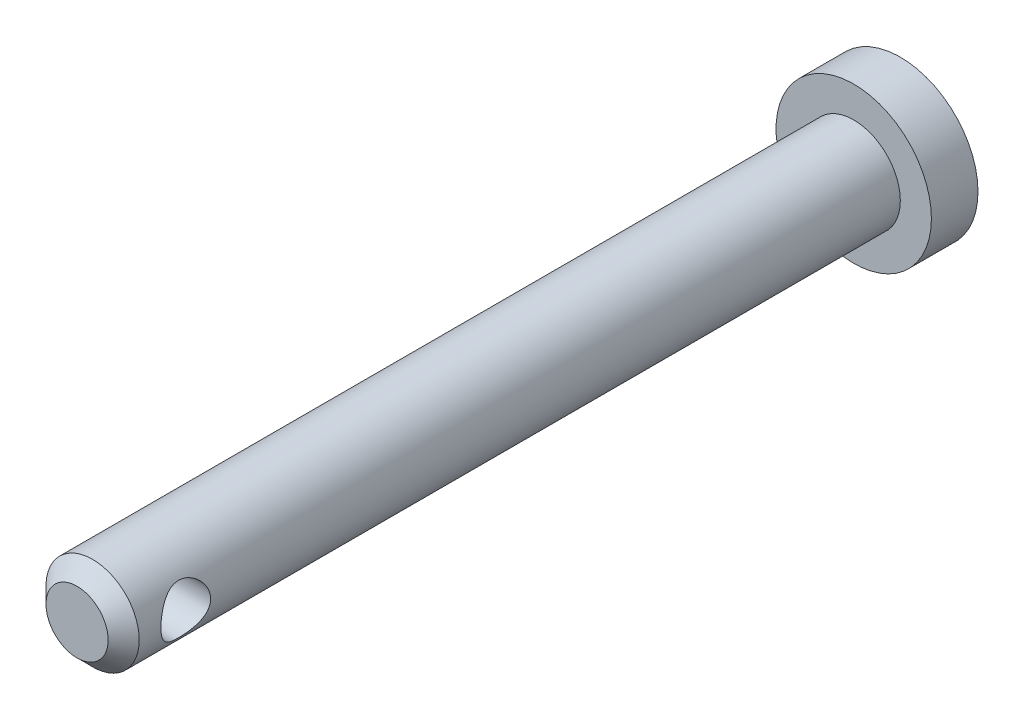
ISO-10303-21;
HEADER;
FILE_DESCRIPTION(('STEP AP214'),'2;1');
FILE_NAME('part.step','',(''),(''),'','','');
FILE_SCHEMA(('AUTOMOTIVE_DESIGN { 1 0 10303 214 1 1 1 1 }'));
ENDSEC;
DATA;
#1=APPLICATION_CONTEXT('core data for automotive mechanical design processes');
#2=APPLICATION_PROTOCOL_DEFINITION('international standard','automotive_design',2000,#1);
#3=PRODUCT_CONTEXT('',#1,'mechanical');
#4=PRODUCT('Part','Part','',(#3));
#5=PRODUCT_RELATED_PRODUCT_CATEGORY('part','',(#4));
#6=PRODUCT_DEFINITION_FORMATION('','',#4);
#7=PRODUCT_DEFINITION_CONTEXT('part definition',#1,'design');
#8=PRODUCT_DEFINITION('design','',#6,#7);
#9=PRODUCT_DEFINITION_SHAPE('','',#8);
#10=(LENGTH_UNIT() NAMED_UNIT(*) SI_UNIT(.MILLI.,.METRE.));
#11=(NAMED_UNIT(*) PLANE_ANGLE_UNIT() SI_UNIT($,.RADIAN.));
#12=(NAMED_UNIT(*) SI_UNIT($,.STERADIAN.) SOLID_ANGLE_UNIT());
#13=UNCERTAINTY_MEASURE_WITH_UNIT(LENGTH_MEASURE(1.E-05),#10,'distance_accuracy_value','');
#14=(GEOMETRIC_REPRESENTATION_CONTEXT(3) GLOBAL_UNCERTAINTY_ASSIGNED_CONTEXT((#13)) GLOBAL_UNIT_ASSIGNED_CONTEXT((#10,
#11,#12)) REPRESENTATION_CONTEXT('',''));
#15=CARTESIAN_POINT('',(0.,0.,0.));
#16=DIRECTION('',(0.,0.,1.));
#17=DIRECTION('',(1.,0.,0.));
#18=AXIS2_PLACEMENT_3D('',#15,#16,#17);
#19=CARTESIAN_POINT('',(0.,0.,1.5));
#20=DIRECTION('',(0.,0.,-1.));
#21=DIRECTION('',(-1.,0.,0.));
#22=AXIS2_PLACEMENT_3D('',#19,#20,#21);
#23=CYLINDRICAL_SURFACE('',#22,2.5);
#24=CARTESIAN_POINT('',(0.,0.,1.5));
#25=DIRECTION('',(0.,0.,1.));
#26=DIRECTION('',(1.,0.,0.));
#27=AXIS2_PLACEMENT_3D('',#24,#25,#26);
#28=CIRCLE('',#27,2.5);
#29=CARTESIAN_POINT('',(2.5,0.,1.5));
#30=VERTEX_POINT('',#29);
#31=EDGE_CURVE('E55',#30,#30,#28,.T.);
#32=ORIENTED_EDGE('',*,*,#31,.F.);
#33=EDGE_LOOP('',(#32));
#34=FACE_BOUND('',#33,.T.);
#35=CARTESIAN_POINT('',(0.,0.,0.));
#36=DIRECTION('',(0.,0.,1.));
#37=DIRECTION('',(1.,0.,0.));
#38=AXIS2_PLACEMENT_3D('',#35,#36,#37);
#39=CIRCLE('',#38,2.5);
#40=CARTESIAN_POINT('',(2.5,0.,0.));
#41=VERTEX_POINT('',#40);
#42=EDGE_CURVE('E100',#41,#41,#39,.T.);
#43=ORIENTED_EDGE('',*,*,#42,.T.);
#44=EDGE_LOOP('',(#43));
#45=FACE_BOUND('',#44,.T.);
#46=ADVANCED_FACE('F37',(#34,#45),#23,.T.);
#47=CARTESIAN_POINT('',(0.,0.,1.5));
#48=DIRECTION('',(0.,0.,1.));
#49=DIRECTION('',(1.,0.,0.));
#50=AXIS2_PLACEMENT_3D('',#47,#48,#49);
#51=PLANE('',#50);
#52=CARTESIAN_POINT('',(0.,0.,1.5));
#53=DIRECTION('',(0.,0.,1.));
#54=DIRECTION('',(1.,0.,0.));
#55=AXIS2_PLACEMENT_3D('',#52,#53,#54);
#56=CIRCLE('',#55,1.5);
#57=CARTESIAN_POINT('',(1.5,0.,1.5));
#58=VERTEX_POINT('',#57);
#59=EDGE_CURVE('E65',#58,#58,#56,.T.);
#60=ORIENTED_EDGE('',*,*,#59,.F.);
#61=EDGE_LOOP('',(#60));
#62=FACE_BOUND('',#61,.T.);
#63=ORIENTED_EDGE('',*,*,#31,.T.);
#64=EDGE_LOOP('',(#63));
#65=FACE_BOUND('',#64,.T.);
#66=ADVANCED_FACE('F85',(#62,#65),#51,.T.);
#67=CARTESIAN_POINT('',(0.,0.,0.));
#68=DIRECTION('',(0.,0.,1.));
#69=DIRECTION('',(1.,0.,0.));
#70=AXIS2_PLACEMENT_3D('',#67,#68,#69);
#71=PLANE('',#70);
#72=ORIENTED_EDGE('',*,*,#42,.F.);
#73=EDGE_LOOP('',(#72));
#74=FACE_BOUND('',#73,.T.);
#75=ADVANCED_FACE('F83',(#74),#71,.F.);
#76=CARTESIAN_POINT('',(0.,0.,26.5));
#77=DIRECTION('',(0.,0.,-1.));
#78=DIRECTION('',(-1.,0.,0.));
#79=AXIS2_PLACEMENT_3D('',#76,#77,#78);
#80=CYLINDRICAL_SURFACE('',#79,1.5);
#81=CARTESIAN_POINT('',(0.,0.,26.));
#82=DIRECTION('',(0.,0.,1.));
#83=DIRECTION('',(1.,0.,0.));
#84=AXIS2_PLACEMENT_3D('',#81,#82,#83);
#85=CIRCLE('',#84,1.5);
#86=CARTESIAN_POINT('',(1.5,0.,26.));
#87=VERTEX_POINT('',#86);
#88=EDGE_CURVE('E10',#87,#87,#85,.F.);
#89=ORIENTED_EDGE('',*,*,#88,.T.);
#90=EDGE_LOOP('',(#89));
#91=FACE_BOUND('',#90,.T.);
#92=CARTESIAN_POINT('',(-1.5,0.,25.3));
#93=CARTESIAN_POINT('',(-1.49999758414449,-0.041714004293709,25.2999972917102));
#94=CARTESIAN_POINT('',(-1.49824189360224,-0.0834672912539168,25.2967184035876));
#95=CARTESIAN_POINT('',(-1.49139129667971,-0.165718197334508,25.283758299134));
#96=CARTESIAN_POINT('',(-1.48629121869364,-0.206213769841147,25.2740671669965));
#97=CARTESIAN_POINT('',(-1.47328036800654,-0.28463859494581,25.2487801601417));
#98=CARTESIAN_POINT('',(-1.46538097991501,-0.322577512237571,25.2332081858101));
#99=CARTESIAN_POINT('',(-1.4474774987237,-0.395235474229211,25.196737448288));
#100=CARTESIAN_POINT('',(-1.43747339607276,-0.429954504316262,25.1758386609244));
#101=CARTESIAN_POINT('',(-1.41547900666031,-0.497767319459638,25.1277484382682));
#102=CARTESIAN_POINT('',(-1.4034011481073,-0.530602027463184,25.1002323964803));
#103=CARTESIAN_POINT('',(-1.37887042167267,-0.591434030661652,25.0403968543133));
#104=CARTESIAN_POINT('',(-1.36641723648963,-0.619427089896365,25.0080731932663));
#105=CARTESIAN_POINT('',(-1.34122140682262,-0.672354419511097,24.9360219415222));
#106=CARTESIAN_POINT('',(-1.32855595701366,-0.696776837026742,24.895887951337));
#107=CARTESIAN_POINT('',(-1.30586838669548,-0.738426416316993,24.8113543186488));
#108=CARTESIAN_POINT('',(-1.29584422578236,-0.755659138193529,24.7669580051933));
#109=CARTESIAN_POINT('',(-1.28057394848523,-0.781243551670881,24.6779457306387));
#110=CARTESIAN_POINT('',(-1.27506829565278,-0.79008311742479,24.6335170279096));
#111=CARTESIAN_POINT('',(-1.26881331156942,-0.800094972405447,24.5434961280342));
#112=CARTESIAN_POINT('',(-1.26805797215382,-0.801276946959552,24.4979054738658));
#113=CARTESIAN_POINT('',(-1.27118648805135,-0.796296021649251,24.4137781343534));
#114=CARTESIAN_POINT('',(-1.27443251356391,-0.791143222976704,24.3751515533778));
#115=CARTESIAN_POINT('',(-1.28406317281932,-0.775413455073682,24.299425376058));
#116=CARTESIAN_POINT('',(-1.29044906914779,-0.764834303757536,24.2623264004943));
#117=CARTESIAN_POINT('',(-1.30576277857079,-0.738390252390662,24.1896619734264));
#118=CARTESIAN_POINT('',(-1.31474447400447,-0.722411944930874,24.154149696915));
#119=CARTESIAN_POINT('',(-1.3342504708289,-0.685716522966987,24.0861304736426));
#120=CARTESIAN_POINT('',(-1.34477545505385,-0.66499730854369,24.053624867631));
#121=CARTESIAN_POINT('',(-1.36804524940245,-0.615868522436842,23.9875141387867));
#122=CARTESIAN_POINT('',(-1.38088899493241,-0.586776291159891,23.9544492647533));
#123=CARTESIAN_POINT('',(-1.40611558623123,-0.523451373374352,23.8934246423101));
#124=CARTESIAN_POINT('',(-1.41849814710228,-0.489215573049461,23.8654680092069));
#125=CARTESIAN_POINT('',(-1.44230010999534,-0.414022077031179,23.8138622850858));
#126=CARTESIAN_POINT('',(-1.45361823088172,-0.37278548441079,23.7905688918061));
#127=CARTESIAN_POINT('',(-1.47310395304255,-0.286226859736143,23.7514521168231));
#128=CARTESIAN_POINT('',(-1.48127436501701,-0.240908517249556,23.7356220679969));
#129=CARTESIAN_POINT('',(-1.4929099561423,-0.151832213955904,23.7133223875927));
#130=CARTESIAN_POINT('',(-1.49673204992477,-0.10830013138203,23.70613929869));
#131=CARTESIAN_POINT('',(-1.50050221027202,-0.0204895975412021,23.6990524967996));
#132=CARTESIAN_POINT('',(-1.50045251716091,0.0237884072844018,23.6991445741977));
#133=CARTESIAN_POINT('',(-1.49667382258832,0.107545959760609,23.7062499288307));
#134=CARTESIAN_POINT('',(-1.49327897244287,0.147096449267733,23.7126346407483));
#135=CARTESIAN_POINT('',(-1.48362188327846,0.224469554831583,23.7311074420979));
#136=CARTESIAN_POINT('',(-1.47735934596487,0.262291990687247,23.7431961248567));
#137=CARTESIAN_POINT('',(-1.46232570811689,0.336250167522202,23.7729749424682));
#138=CARTESIAN_POINT('',(-1.4534959496239,0.372320333376869,23.7907972349183));
#139=CARTESIAN_POINT('',(-1.43413438081761,0.441062157410962,23.8313751543016));
#140=CARTESIAN_POINT('',(-1.42360190671964,0.473732482002725,23.8541327063769));
#141=CARTESIAN_POINT('',(-1.40047645695353,0.538489644606411,23.9067448011077));
#142=CARTESIAN_POINT('',(-1.38778372966929,0.570134865108252,23.9370996673289));
#143=CARTESIAN_POINT('',(-1.36252708549313,0.628109862741503,24.0026128359152));
#144=CARTESIAN_POINT('',(-1.34996329805962,0.654434715474712,24.037775538292));
#145=CARTESIAN_POINT('',(-1.32549514327965,0.70274076630891,24.114826486175));
#146=CARTESIAN_POINT('',(-1.31369210729127,0.724310244689174,24.1570081387794));
#147=CARTESIAN_POINT('',(-1.29347935062968,0.759824848176573,24.2452100900862));
#148=CARTESIAN_POINT('',(-1.28506480237657,0.773780830369481,24.2912248141218));
#149=CARTESIAN_POINT('',(-1.27372513461019,0.792295451806951,24.3810138470975));
#150=CARTESIAN_POINT('',(-1.27034308682665,0.797640611545243,24.4245661837155));
#151=CARTESIAN_POINT('',(-1.26816359887642,0.801103834511683,24.5120603141804));
#152=CARTESIAN_POINT('',(-1.26936303319563,0.799226824740039,24.5560018221226));
#153=CARTESIAN_POINT('',(-1.27570247677833,0.789056350744178,24.6373463548581));
#154=CARTESIAN_POINT('',(-1.28034575552508,0.781570591370404,24.6748948907275));
#155=CARTESIAN_POINT('',(-1.29238691721072,0.761493436479322,24.7481339575411));
#156=CARTESIAN_POINT('',(-1.29978582163339,0.748900147495983,24.7838237938842));
#157=CARTESIAN_POINT('',(-1.3170766557443,0.718080352112419,24.8549047795466));
#158=CARTESIAN_POINT('',(-1.32709848411839,0.699543207429633,24.8901285674158));
#159=CARTESIAN_POINT('',(-1.34833960706443,0.657671226676286,24.9572019357598));
#160=CARTESIAN_POINT('',(-1.35955954483521,0.634333807313365,24.9890496853594));
#161=CARTESIAN_POINT('',(-1.38387269806828,0.579583602633467,25.0532730938803));
#162=CARTESIAN_POINT('',(-1.39700212075101,0.547491018352179,25.0850587404488));
#163=CARTESIAN_POINT('',(-1.42222830059072,0.478150164559821,25.1429722703881));
#164=CARTESIAN_POINT('',(-1.43432438618419,0.440898582826826,25.1690964911038));
#165=CARTESIAN_POINT('',(-1.45651015109521,0.3610220026222,25.2154339599367));
#166=CARTESIAN_POINT('',(-1.4665441059256,0.318288665753908,25.2354886264249));
#167=CARTESIAN_POINT('',(-1.48303856571174,0.229399331630396,25.2678536227339));
#168=CARTESIAN_POINT('',(-1.48950860714735,0.183252846928633,25.2801846321223));
#169=CARTESIAN_POINT('',(-1.49584776109147,0.113807677907483,25.2921926712721));
#170=CARTESIAN_POINT('',(-1.49739944315896,0.0911777471195393,25.2951148842016));
#171=CARTESIAN_POINT('',(-1.49947623062919,0.0457024774465215,25.2990193021585));
#172=CARTESIAN_POINT('',(-1.50000132376498,0.0228571359907307,25.300001484004));
#173=CARTESIAN_POINT('',(-1.5,0.,25.3));
#174=B_SPLINE_CURVE_WITH_KNOTS('',3,(#92,#93,#94,#95,#96,#97,#98,#99,#100,#101,#102,#103,#104,
#105,#106,#107,#108,#109,#110,#111,#112,#113,#114,#115,#116,#117,#118,#119,#120,#121,#122,#123,
#124,#125,#126,#127,#128,#129,#130,#131,#132,#133,#134,#135,#136,#137,#138,#139,#140,#141,#142,
#143,#144,#145,#146,#147,#148,#149,#150,#151,#152,#153,#154,#155,#156,#157,#158,#159,#160,#161,
#162,#163,#164,#165,#166,#167,#168,#169,#170,#171,#172,#173),.UNSPECIFIED.,.T.,.F.,(4,2,2,2,2,2,
2,2,2,2,2,2,2,2,2,2,2,2,2,2,2,2,2,2,2,2,2,2,2,2,2,2,2,2,2,2,2,2,2,2,4),(0.,0.125049785968992,
0.250293400579707,0.375033395431376,0.49977395636337,0.632758937517725,0.765859685119312,
0.911100210896849,1.0562282067719,1.19228300426694,1.32816568589671,1.44492819552126,
1.56173769541659,1.68117137196064,1.80065805275817,1.93770170276477,2.07482865313357,
2.22012229846781,2.36528590361979,2.49740165319181,2.62944095746674,2.74950324975935,
2.86957803367866,2.99264692026345,3.11576390008819,3.2521377258514,3.38863720347795,
3.53432584534743,3.67980618389779,3.81103787448892,3.94218005404204,4.05738088818269,
4.17262446873053,4.29529226385601,4.41802624681407,4.55851375899381,4.69909188991154,
4.84307664846753,4.98667423094966,5.05519428454421,5.12371515689633),.UNSPECIFIED.);
#175=CARTESIAN_POINT('',(-1.5,0.,25.3));
#176=VERTEX_POINT('',#175);
#177=EDGE_CURVE('E58',#176,#176,#174,.T.);
#178=ORIENTED_EDGE('',*,*,#177,.T.);
#179=EDGE_LOOP('',(#178));
#180=FACE_BOUND('',#179,.T.);
#181=CARTESIAN_POINT('',(1.5,0.,23.7));
#182=CARTESIAN_POINT('',(1.49999758414449,-0.0417140042937088,23.7000027082898));
#183=CARTESIAN_POINT('',(1.49824189360224,-0.0834672912539165,23.7032815964124));
#184=CARTESIAN_POINT('',(1.49139129667971,-0.165718197334508,23.7162417008661));
#185=CARTESIAN_POINT('',(1.48629121869364,-0.206213769841147,23.7259328330035));
#186=CARTESIAN_POINT('',(1.47328036800654,-0.28463859494581,23.7512198398583));
#187=CARTESIAN_POINT('',(1.46538097991501,-0.322577512237571,23.7667918141899));
#188=CARTESIAN_POINT('',(1.4474774987237,-0.395235474229211,23.803262551712));
#189=CARTESIAN_POINT('',(1.43747339607276,-0.429954504316262,23.8241613390756));
#190=CARTESIAN_POINT('',(1.41547900666031,-0.497767319459638,23.8722515617318));
#191=CARTESIAN_POINT('',(1.4034011481073,-0.530602027463184,23.8997676035198));
#192=CARTESIAN_POINT('',(1.37887042167267,-0.591434030661653,23.9596031456868));
#193=CARTESIAN_POINT('',(1.36641723648963,-0.619427089896365,23.9919268067337));
#194=CARTESIAN_POINT('',(1.34122140682262,-0.672354419511098,24.0639780584778));
#195=CARTESIAN_POINT('',(1.32855595701366,-0.696776837026743,24.1041120486631));
#196=CARTESIAN_POINT('',(1.30586838669548,-0.738426416316994,24.1886456813512));
#197=CARTESIAN_POINT('',(1.29584422578236,-0.755659138193529,24.2330419948068));
#198=CARTESIAN_POINT('',(1.28057394848523,-0.781243551670881,24.3220542693613));
#199=CARTESIAN_POINT('',(1.27506829565278,-0.79008311742479,24.3664829720904));
#200=CARTESIAN_POINT('',(1.26881331156942,-0.800094972405447,24.4565038719658));
#201=CARTESIAN_POINT('',(1.26805797215382,-0.801276946959552,24.5020945261342));
#202=CARTESIAN_POINT('',(1.27118648805135,-0.796296021649251,24.5862218656466));
#203=CARTESIAN_POINT('',(1.27443251356391,-0.791143222976704,24.6248484466222));
#204=CARTESIAN_POINT('',(1.28406317281932,-0.775413455073682,24.700574623942));
#205=CARTESIAN_POINT('',(1.29044906914779,-0.764834303757536,24.7376735995057));
#206=CARTESIAN_POINT('',(1.30576277857079,-0.738390252390662,24.8103380265736));
#207=CARTESIAN_POINT('',(1.31474447400447,-0.722411944930874,24.845850303085));
#208=CARTESIAN_POINT('',(1.3342504708289,-0.685716522966987,24.9138695263574));
#209=CARTESIAN_POINT('',(1.34477545505385,-0.66499730854369,24.946375132369));
#210=CARTESIAN_POINT('',(1.36804524940245,-0.615868522436842,25.0124858612133));
#211=CARTESIAN_POINT('',(1.38088899493241,-0.586776291159891,25.0455507352467));
#212=CARTESIAN_POINT('',(1.40611558623123,-0.523451373374352,25.10657535769));
#213=CARTESIAN_POINT('',(1.41849814710228,-0.489215573049461,25.1345319907931));
#214=CARTESIAN_POINT('',(1.44230010999534,-0.414022077031179,25.1861377149142));
#215=CARTESIAN_POINT('',(1.45361823088172,-0.37278548441079,25.2094311081939));
#216=CARTESIAN_POINT('',(1.47310395304255,-0.286226859736143,25.2485478831769));
#217=CARTESIAN_POINT('',(1.48127436501701,-0.240908517249557,25.2643779320031));
#218=CARTESIAN_POINT('',(1.4929099561423,-0.151832213955904,25.2866776124073));
#219=CARTESIAN_POINT('',(1.49673204992477,-0.10830013138203,25.29386070131));
#220=CARTESIAN_POINT('',(1.50050221027202,-0.0204895975412028,25.3009475032004));
#221=CARTESIAN_POINT('',(1.50045251716091,0.0237884072844011,25.3008554258023));
#222=CARTESIAN_POINT('',(1.49667382258832,0.107545959760608,25.2937500711693));
#223=CARTESIAN_POINT('',(1.49327897244287,0.147096449267731,25.2873653592517));
#224=CARTESIAN_POINT('',(1.48362188327846,0.224469554831582,25.2688925579021));
#225=CARTESIAN_POINT('',(1.47735934596487,0.262291990687247,25.2568038751433));
#226=CARTESIAN_POINT('',(1.46232570811689,0.336250167522202,25.2270250575318));
#227=CARTESIAN_POINT('',(1.4534959496239,0.372320333376869,25.2092027650817));
#228=CARTESIAN_POINT('',(1.43413438081761,0.441062157410961,25.1686248456984));
#229=CARTESIAN_POINT('',(1.42360190671964,0.473732482002724,25.1458672936231));
#230=CARTESIAN_POINT('',(1.40047645695353,0.538489644606411,25.0932551988923));
#231=CARTESIAN_POINT('',(1.38778372966929,0.570134865108252,25.0629003326711));
#232=CARTESIAN_POINT('',(1.36252708549313,0.628109862741503,24.9973871640848));
#233=CARTESIAN_POINT('',(1.34996329805962,0.654434715474711,24.962224461708));
#234=CARTESIAN_POINT('',(1.32549514327965,0.70274076630891,24.885173513825));
#235=CARTESIAN_POINT('',(1.31369210729127,0.724310244689175,24.8429918612206));
#236=CARTESIAN_POINT('',(1.29347935062968,0.759824848176572,24.7547899099138));
#237=CARTESIAN_POINT('',(1.28506480237657,0.77378083036948,24.7087751858783));
#238=CARTESIAN_POINT('',(1.27372513461019,0.792295451806951,24.6189861529025));
#239=CARTESIAN_POINT('',(1.27034308682665,0.797640611545243,24.5754338162846));
#240=CARTESIAN_POINT('',(1.26816359887642,0.801103834511684,24.4879396858196));
#241=CARTESIAN_POINT('',(1.26936303319563,0.799226824740039,24.4439981778774));
#242=CARTESIAN_POINT('',(1.27570247677833,0.789056350744178,24.362653645142));
#243=CARTESIAN_POINT('',(1.28034575552508,0.781570591370404,24.3251051092725));
#244=CARTESIAN_POINT('',(1.29238691721072,0.761493436479322,24.2518660424589));
#245=CARTESIAN_POINT('',(1.29978582163339,0.748900147495983,24.2161762061158));
#246=CARTESIAN_POINT('',(1.3170766557443,0.718080352112419,24.1450952204534));
#247=CARTESIAN_POINT('',(1.32709848411839,0.699543207429633,24.1098714325842));
#248=CARTESIAN_POINT('',(1.34833960706443,0.657671226676287,24.0427980642403));
#249=CARTESIAN_POINT('',(1.35955954483521,0.634333807313366,24.0109503146406));
#250=CARTESIAN_POINT('',(1.38387269806828,0.579583602633468,23.9467269061197));
#251=CARTESIAN_POINT('',(1.39700212075101,0.54749101835218,23.9149412595512));
#252=CARTESIAN_POINT('',(1.42222830059072,0.478150164559821,23.8570277296119));
#253=CARTESIAN_POINT('',(1.43432438618419,0.440898582826826,23.8309035088962));
#254=CARTESIAN_POINT('',(1.45651015109521,0.361022002622201,23.7845660400633));
#255=CARTESIAN_POINT('',(1.4665441059256,0.318288665753911,23.7645113735751));
#256=CARTESIAN_POINT('',(1.48303856571174,0.229399331630399,23.7321463772661));
#257=CARTESIAN_POINT('',(1.48950860714735,0.183252846928634,23.7198153678777));
#258=CARTESIAN_POINT('',(1.49584776109147,0.113807677907483,23.7078073287279));
#259=CARTESIAN_POINT('',(1.49739944315896,0.0911777471195393,23.7048851157984));
#260=CARTESIAN_POINT('',(1.49947623062919,0.0457024774465215,23.7009806978415));
#261=CARTESIAN_POINT('',(1.50000132376498,0.0228571359907307,23.699998515996));
#262=CARTESIAN_POINT('',(1.5,0.,23.7));
#263=B_SPLINE_CURVE_WITH_KNOTS('',3,(#181,#182,#183,#184,#185,#186,#187,#188,#189,#190,#191,
#192,#193,#194,#195,#196,#197,#198,#199,#200,#201,#202,#203,#204,#205,#206,#207,#208,#209,#210,
#211,#212,#213,#214,#215,#216,#217,#218,#219,#220,#221,#222,#223,#224,#225,#226,#227,#228,#229,
#230,#231,#232,#233,#234,#235,#236,#237,#238,#239,#240,#241,#242,#243,#244,#245,#246,#247,#248,
#249,#250,#251,#252,#253,#254,#255,#256,#257,#258,#259,#260,#261,#262),.UNSPECIFIED.,.T.,.F.,(4,
2,2,2,2,2,2,2,2,2,2,2,2,2,2,2,2,2,2,2,2,2,2,2,2,2,2,2,2,2,2,2,2,2,2,2,2,2,2,2,4),(0.,
0.125049785968991,0.250293400579707,0.375033395431376,0.49977395636337,0.632758937517725,
0.765859685119312,0.911100210896852,1.0562282067719,1.19228300426694,1.32816568589671,
1.44492819552126,1.56173769541659,1.68117137196064,1.80065805275817,1.93770170276477,
2.07482865313357,2.22012229846781,2.36528590361979,2.49740165319181,2.62944095746674,
2.74950324975935,2.86957803367866,2.99264692026345,3.11576390008819,3.2521377258514,
3.38863720347795,3.53432584534744,3.67980618389779,3.81103787448891,3.94218005404204,
4.05738088818269,4.17262446873053,4.29529226385601,4.41802624681407,4.55851375899381,
4.69909188991154,4.84307664846753,4.98667423094966,5.05519428454421,5.12371515689633),.UNSPECIFIED.);
#264=CARTESIAN_POINT('',(1.5,0.,23.7));
#265=VERTEX_POINT('',#264);
#266=EDGE_CURVE('E50',#265,#265,#263,.T.);
#267=ORIENTED_EDGE('',*,*,#266,.T.);
#268=EDGE_LOOP('',(#267));
#269=FACE_BOUND('',#268,.T.);
#270=ORIENTED_EDGE('',*,*,#59,.T.);
#271=EDGE_LOOP('',(#270));
#272=FACE_BOUND('',#271,.T.);
#273=ADVANCED_FACE('F69',(#91,#180,#269,#272),#80,.T.);
#274=CARTESIAN_POINT('',(0.,0.,26.5));
#275=DIRECTION('',(0.,0.,1.));
#276=DIRECTION('',(1.,0.,0.));
#277=AXIS2_PLACEMENT_3D('',#274,#275,#276);
#278=PLANE('',#277);
#279=CARTESIAN_POINT('',(0.,0.,26.5));
#280=DIRECTION('',(0.,0.,1.));
#281=DIRECTION('',(1.,0.,0.));
#282=AXIS2_PLACEMENT_3D('',#279,#280,#281);
#283=CIRCLE('',#282,0.999999999999994);
#284=CARTESIAN_POINT('',(0.999999999999994,0.,26.5));
#285=VERTEX_POINT('',#284);
#286=EDGE_CURVE('E45',#285,#285,#283,.T.);
#287=ORIENTED_EDGE('',*,*,#286,.T.);
#288=EDGE_LOOP('',(#287));
#289=FACE_BOUND('',#288,.T.);
#290=ADVANCED_FACE('F76',(#289),#278,.T.);
#291=CARTESIAN_POINT('',(-2.5,0.,24.5));
#292=DIRECTION('',(1.,0.,0.));
#293=DIRECTION('',(0.,0.,-1.));
#294=AXIS2_PLACEMENT_3D('',#291,#292,#293);
#295=CYLINDRICAL_SURFACE('',#294,0.799999999999999);
#296=ORIENTED_EDGE('',*,*,#177,.F.);
#297=EDGE_LOOP('',(#296));
#298=FACE_BOUND('',#297,.T.);
#299=ORIENTED_EDGE('',*,*,#266,.F.);
#300=EDGE_LOOP('',(#299));
#301=FACE_BOUND('',#300,.T.);
#302=ADVANCED_FACE('F73',(#298,#301),#295,.F.);
#303=CARTESIAN_POINT('',(0.,0.,26.5));
#304=DIRECTION('',(0.,0.,-1.));
#305=DIRECTION('',(-1.,0.,0.));
#306=AXIS2_PLACEMENT_3D('',#303,#304,#305);
#307=CONICAL_SURFACE('',#306,0.999999999999994,0.785398163397447);
#308=ORIENTED_EDGE('',*,*,#88,.F.);
#309=EDGE_LOOP('',(#308));
#310=FACE_BOUND('',#309,.T.);
#311=ORIENTED_EDGE('',*,*,#286,.F.);
#312=EDGE_LOOP('',(#311));
#313=FACE_BOUND('',#312,.T.);
#314=ADVANCED_FACE('F39',(#310,#313),#307,.T.);
#315=CLOSED_SHELL('',(#46,#66,#75,#273,#290,#302,#314));
#316=MANIFOLD_SOLID_BREP('B2',#315);
#317=ADVANCED_BREP_SHAPE_REPRESENTATION('',(#18,#316),#14);
#318=SHAPE_DEFINITION_REPRESENTATION(#9,#317);
ENDSEC;
END-ISO-10303-21;
